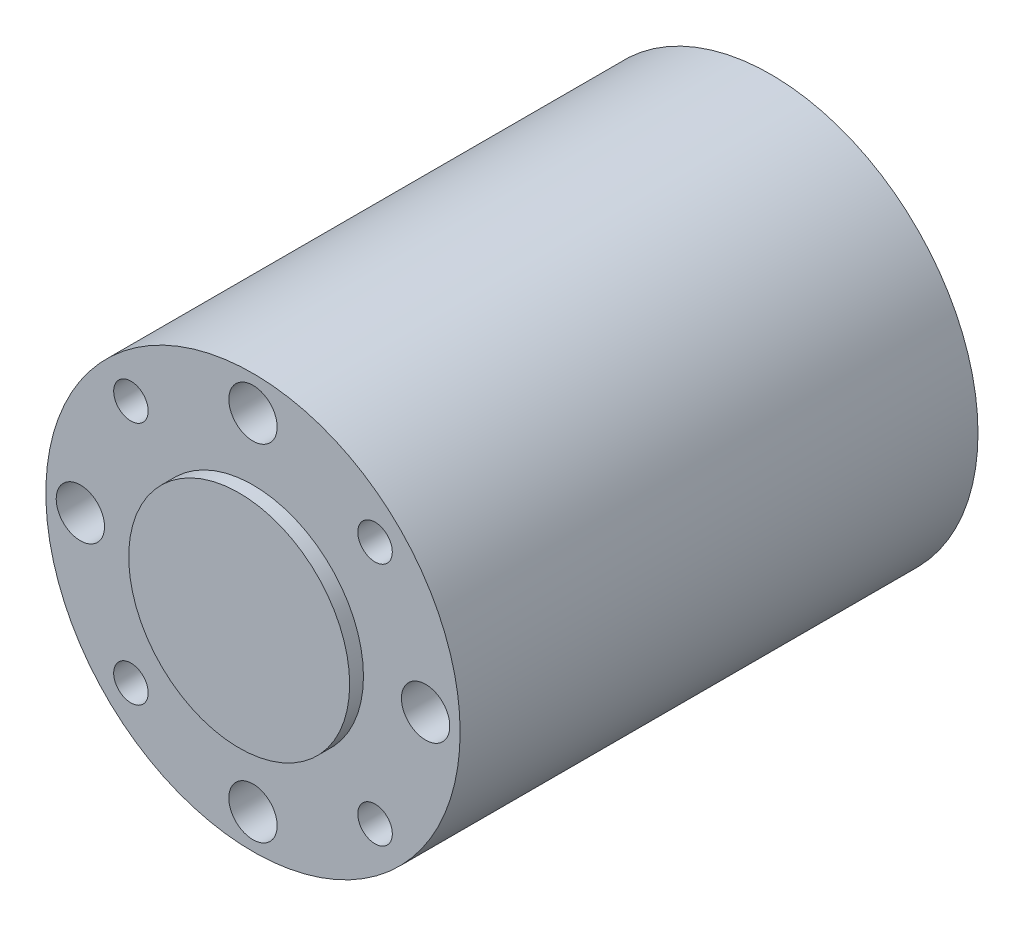
ISO-10303-21;
HEADER;
FILE_DESCRIPTION(('STEP AP214'),'2;1');
FILE_NAME('part.step','',(''),(''),'','','');
FILE_SCHEMA(('AUTOMOTIVE_DESIGN { 1 0 10303 214 1 1 1 1 }'));
ENDSEC;
DATA;
#1=APPLICATION_CONTEXT('core data for automotive mechanical design processes');
#2=APPLICATION_PROTOCOL_DEFINITION('international standard','automotive_design',2000,#1);
#3=PRODUCT_CONTEXT('',#1,'mechanical');
#4=PRODUCT('Part','Part','',(#3));
#5=PRODUCT_RELATED_PRODUCT_CATEGORY('part','',(#4));
#6=PRODUCT_DEFINITION_FORMATION('','',#4);
#7=PRODUCT_DEFINITION_CONTEXT('part definition',#1,'design');
#8=PRODUCT_DEFINITION('design','',#6,#7);
#9=PRODUCT_DEFINITION_SHAPE('','',#8);
#10=(LENGTH_UNIT() NAMED_UNIT(*) SI_UNIT(.MILLI.,.METRE.));
#11=(NAMED_UNIT(*) PLANE_ANGLE_UNIT() SI_UNIT($,.RADIAN.));
#12=(NAMED_UNIT(*) SI_UNIT($,.STERADIAN.) SOLID_ANGLE_UNIT());
#13=UNCERTAINTY_MEASURE_WITH_UNIT(LENGTH_MEASURE(1.E-05),#10,'distance_accuracy_value','');
#14=(GEOMETRIC_REPRESENTATION_CONTEXT(3) GLOBAL_UNCERTAINTY_ASSIGNED_CONTEXT((#13)) GLOBAL_UNIT_ASSIGNED_CONTEXT((#10,
#11,#12)) REPRESENTATION_CONTEXT('',''));
#15=CARTESIAN_POINT('',(0.,0.,0.));
#16=DIRECTION('',(0.,0.,1.));
#17=DIRECTION('',(1.,0.,0.));
#18=AXIS2_PLACEMENT_3D('',#15,#16,#17);
#19=CARTESIAN_POINT('',(0.,0.,75.));
#20=DIRECTION('',(0.,0.,-1.));
#21=DIRECTION('',(-1.,0.,0.));
#22=AXIS2_PLACEMENT_3D('',#19,#20,#21);
#23=CYLINDRICAL_SURFACE('',#22,30.);
#24=CARTESIAN_POINT('',(0.,0.,75.));
#25=DIRECTION('',(0.,0.,1.));
#26=DIRECTION('',(1.,0.,0.));
#27=AXIS2_PLACEMENT_3D('',#24,#25,#26);
#28=CIRCLE('',#27,30.);
#29=CARTESIAN_POINT('',(30.,0.,75.));
#30=VERTEX_POINT('',#29);
#31=EDGE_CURVE('E10',#30,#30,#28,.T.);
#32=ORIENTED_EDGE('',*,*,#31,.F.);
#33=EDGE_LOOP('',(#32));
#34=FACE_BOUND('',#33,.T.);
#35=CARTESIAN_POINT('',(0.,0.,0.));
#36=DIRECTION('',(0.,0.,1.));
#37=DIRECTION('',(1.,0.,0.));
#38=AXIS2_PLACEMENT_3D('',#35,#36,#37);
#39=CIRCLE('',#38,30.);
#40=CARTESIAN_POINT('',(30.,0.,0.));
#41=VERTEX_POINT('',#40);
#42=EDGE_CURVE('E42',#41,#41,#39,.T.);
#43=ORIENTED_EDGE('',*,*,#42,.T.);
#44=EDGE_LOOP('',(#43));
#45=FACE_BOUND('',#44,.T.);
#46=ADVANCED_FACE('F39',(#34,#45),#23,.T.);
#47=CARTESIAN_POINT('',(0.,0.,75.));
#48=DIRECTION('',(0.,0.,1.));
#49=DIRECTION('',(1.,0.,0.));
#50=AXIS2_PLACEMENT_3D('',#47,#48,#49);
#51=PLANE('',#50);
#52=CARTESIAN_POINT('',(0.,0.,75.));
#53=DIRECTION('',(0.,0.,1.));
#54=DIRECTION('',(1.,0.,0.));
#55=AXIS2_PLACEMENT_3D('',#52,#53,#54);
#56=CIRCLE('',#55,16.);
#57=CARTESIAN_POINT('',(16.,0.,75.));
#58=VERTEX_POINT('',#57);
#59=EDGE_CURVE('E99',#58,#58,#56,.T.);
#60=ORIENTED_EDGE('',*,*,#59,.F.);
#61=EDGE_LOOP('',(#60));
#62=FACE_BOUND('',#61,.T.);
#63=CARTESIAN_POINT('',(0.,25.,75.));
#64=DIRECTION('',(0.,0.,1.));
#65=DIRECTION('',(1.,0.,0.));
#66=AXIS2_PLACEMENT_3D('',#63,#64,#65);
#67=CIRCLE('',#66,3.5);
#68=CARTESIAN_POINT('',(3.5,25.,75.));
#69=VERTEX_POINT('',#68);
#70=EDGE_CURVE('E76',#69,#69,#67,.T.);
#71=ORIENTED_EDGE('',*,*,#70,.F.);
#72=EDGE_LOOP('',(#71));
#73=FACE_BOUND('',#72,.T.);
#74=CARTESIAN_POINT('',(-5.44703171456717E-13,-25.,75.));
#75=DIRECTION('',(0.,0.,1.));
#76=DIRECTION('',(1.,0.,0.));
#77=AXIS2_PLACEMENT_3D('',#74,#75,#76);
#78=CIRCLE('',#77,3.5);
#79=CARTESIAN_POINT('',(3.49999999999946,-25.,75.));
#80=VERTEX_POINT('',#79);
#81=EDGE_CURVE('E80',#80,#80,#78,.T.);
#82=ORIENTED_EDGE('',*,*,#81,.F.);
#83=EDGE_LOOP('',(#82));
#84=FACE_BOUND('',#83,.T.);
#85=CARTESIAN_POINT('',(-25.,2.67147415300428E-13,75.));
#86=DIRECTION('',(0.,0.,1.));
#87=DIRECTION('',(-1.,0.,0.));
#88=AXIS2_PLACEMENT_3D('',#85,#86,#87);
#89=CIRCLE('',#88,3.5);
#90=CARTESIAN_POINT('',(-28.5,2.67147415300428E-13,75.));
#91=VERTEX_POINT('',#90);
#92=EDGE_CURVE('E87',#91,#91,#89,.T.);
#93=ORIENTED_EDGE('',*,*,#92,.F.);
#94=EDGE_LOOP('',(#93));
#95=FACE_BOUND('',#94,.T.);
#96=CARTESIAN_POINT('',(25.,2.81025203108243E-13,75.));
#97=DIRECTION('',(0.,0.,1.));
#98=DIRECTION('',(-1.,0.,0.));
#99=AXIS2_PLACEMENT_3D('',#96,#97,#98);
#100=CIRCLE('',#99,3.50000000000001);
#101=CARTESIAN_POINT('',(21.5,2.81025203108243E-13,75.));
#102=VERTEX_POINT('',#101);
#103=EDGE_CURVE('E55',#102,#102,#100,.T.);
#104=ORIENTED_EDGE('',*,*,#103,.F.);
#105=EDGE_LOOP('',(#104));
#106=FACE_BOUND('',#105,.T.);
#107=CARTESIAN_POINT('',(-17.6776695296636,-17.6776695296638,75.));
#108=DIRECTION('',(0.,0.,1.));
#109=DIRECTION('',(1.,0.,0.));
#110=AXIS2_PLACEMENT_3D('',#107,#108,#109);
#111=CIRCLE('',#110,2.5);
#112=CARTESIAN_POINT('',(-15.1776695296636,-17.6776695296638,75.));
#113=VERTEX_POINT('',#112);
#114=EDGE_CURVE('E54',#113,#113,#111,.T.);
#115=ORIENTED_EDGE('',*,*,#114,.F.);
#116=EDGE_LOOP('',(#115));
#117=FACE_BOUND('',#116,.T.);
#118=CARTESIAN_POINT('',(17.6776695296636,-17.6776695296638,75.));
#119=DIRECTION('',(0.,0.,1.));
#120=DIRECTION('',(-1.,0.,0.));
#121=AXIS2_PLACEMENT_3D('',#118,#119,#120);
#122=CIRCLE('',#121,2.5);
#123=CARTESIAN_POINT('',(15.1776695296636,-17.6776695296638,75.));
#124=VERTEX_POINT('',#123);
#125=EDGE_CURVE('E61',#124,#124,#122,.T.);
#126=ORIENTED_EDGE('',*,*,#125,.F.);
#127=EDGE_LOOP('',(#126));
#128=FACE_BOUND('',#127,.T.);
#129=CARTESIAN_POINT('',(17.6776695296636,17.6776695296638,75.));
#130=DIRECTION('',(0.,0.,1.));
#131=DIRECTION('',(1.,0.,0.));
#132=AXIS2_PLACEMENT_3D('',#129,#130,#131);
#133=CIRCLE('',#132,2.5);
#134=CARTESIAN_POINT('',(20.1776695296636,17.6776695296638,75.));
#135=VERTEX_POINT('',#134);
#136=EDGE_CURVE('E67',#135,#135,#133,.T.);
#137=ORIENTED_EDGE('',*,*,#136,.F.);
#138=EDGE_LOOP('',(#137));
#139=FACE_BOUND('',#138,.T.);
#140=CARTESIAN_POINT('',(-17.6776695296636,17.6776695296638,75.));
#141=DIRECTION('',(0.,0.,1.));
#142=DIRECTION('',(-1.,0.,0.));
#143=AXIS2_PLACEMENT_3D('',#140,#141,#142);
#144=CIRCLE('',#143,2.5);
#145=CARTESIAN_POINT('',(-20.1776695296636,17.6776695296638,75.));
#146=VERTEX_POINT('',#145);
#147=EDGE_CURVE('E73',#146,#146,#144,.T.);
#148=ORIENTED_EDGE('',*,*,#147,.F.);
#149=EDGE_LOOP('',(#148));
#150=FACE_BOUND('',#149,.T.);
#151=ORIENTED_EDGE('',*,*,#31,.T.);
#152=EDGE_LOOP('',(#151));
#153=FACE_BOUND('',#152,.T.);
#154=ADVANCED_FACE('F114',(#62,#73,#84,#95,#106,#117,#128,#139,#150,#153),#51,.T.);
#155=CARTESIAN_POINT('',(0.,0.,0.));
#156=DIRECTION('',(0.,0.,1.));
#157=DIRECTION('',(1.,0.,0.));
#158=AXIS2_PLACEMENT_3D('',#155,#156,#157);
#159=PLANE('',#158);
#160=ORIENTED_EDGE('',*,*,#42,.F.);
#161=EDGE_LOOP('',(#160));
#162=FACE_BOUND('',#161,.T.);
#163=ADVANCED_FACE('F117',(#162),#159,.F.);
#164=CARTESIAN_POINT('',(-17.6776695296636,17.6776695296638,65.));
#165=DIRECTION('',(0.,0.,1.));
#166=DIRECTION('',(1.,0.,0.));
#167=AXIS2_PLACEMENT_3D('',#164,#165,#166);
#168=CYLINDRICAL_SURFACE('',#167,2.5);
#169=CARTESIAN_POINT('',(-17.6776695296636,17.6776695296638,65.));
#170=DIRECTION('',(0.,0.,1.));
#171=DIRECTION('',(-1.,0.,0.));
#172=AXIS2_PLACEMENT_3D('',#169,#170,#171);
#173=CIRCLE('',#172,2.5);
#174=CARTESIAN_POINT('',(-20.1776695296636,17.6776695296638,65.));
#175=VERTEX_POINT('',#174);
#176=EDGE_CURVE('E70',#175,#175,#173,.T.);
#177=ORIENTED_EDGE('',*,*,#176,.F.);
#178=EDGE_LOOP('',(#177));
#179=FACE_BOUND('',#178,.T.);
#180=ORIENTED_EDGE('',*,*,#147,.T.);
#181=EDGE_LOOP('',(#180));
#182=FACE_BOUND('',#181,.T.);
#183=ADVANCED_FACE('F135',(#179,#182),#168,.F.);
#184=CARTESIAN_POINT('',(-17.6776695296636,17.6776695296638,65.));
#185=DIRECTION('',(0.,0.,-1.));
#186=DIRECTION('',(-1.,0.,0.));
#187=AXIS2_PLACEMENT_3D('',#184,#185,#186);
#188=PLANE('',#187);
#189=ORIENTED_EDGE('',*,*,#176,.T.);
#190=EDGE_LOOP('',(#189));
#191=FACE_BOUND('',#190,.T.);
#192=ADVANCED_FACE('F137',(#191),#188,.F.);
#193=CARTESIAN_POINT('',(17.6776695296636,17.6776695296638,65.));
#194=DIRECTION('',(0.,0.,1.));
#195=DIRECTION('',(1.,0.,0.));
#196=AXIS2_PLACEMENT_3D('',#193,#194,#195);
#197=CYLINDRICAL_SURFACE('',#196,2.5);
#198=CARTESIAN_POINT('',(17.6776695296636,17.6776695296638,65.));
#199=DIRECTION('',(0.,0.,1.));
#200=DIRECTION('',(1.,0.,0.));
#201=AXIS2_PLACEMENT_3D('',#198,#199,#200);
#202=CIRCLE('',#201,2.5);
#203=CARTESIAN_POINT('',(20.1776695296636,17.6776695296638,65.));
#204=VERTEX_POINT('',#203);
#205=EDGE_CURVE('E64',#204,#204,#202,.T.);
#206=ORIENTED_EDGE('',*,*,#205,.F.);
#207=EDGE_LOOP('',(#206));
#208=FACE_BOUND('',#207,.T.);
#209=ORIENTED_EDGE('',*,*,#136,.T.);
#210=EDGE_LOOP('',(#209));
#211=FACE_BOUND('',#210,.T.);
#212=ADVANCED_FACE('F144',(#208,#211),#197,.F.);
#213=CARTESIAN_POINT('',(17.6776695296636,17.6776695296638,65.));
#214=DIRECTION('',(0.,0.,1.));
#215=DIRECTION('',(1.,0.,0.));
#216=AXIS2_PLACEMENT_3D('',#213,#214,#215);
#217=PLANE('',#216);
#218=ORIENTED_EDGE('',*,*,#205,.T.);
#219=EDGE_LOOP('',(#218));
#220=FACE_BOUND('',#219,.T.);
#221=ADVANCED_FACE('F185',(#220),#217,.T.);
#222=CARTESIAN_POINT('',(17.6776695296636,-17.6776695296638,65.));
#223=DIRECTION('',(0.,0.,1.));
#224=DIRECTION('',(1.,0.,0.));
#225=AXIS2_PLACEMENT_3D('',#222,#223,#224);
#226=CYLINDRICAL_SURFACE('',#225,2.5);
#227=CARTESIAN_POINT('',(17.6776695296636,-17.6776695296638,65.));
#228=DIRECTION('',(0.,0.,1.));
#229=DIRECTION('',(-1.,0.,0.));
#230=AXIS2_PLACEMENT_3D('',#227,#228,#229);
#231=CIRCLE('',#230,2.5);
#232=CARTESIAN_POINT('',(15.1776695296636,-17.6776695296638,65.));
#233=VERTEX_POINT('',#232);
#234=EDGE_CURVE('E58',#233,#233,#231,.T.);
#235=ORIENTED_EDGE('',*,*,#234,.F.);
#236=EDGE_LOOP('',(#235));
#237=FACE_BOUND('',#236,.T.);
#238=ORIENTED_EDGE('',*,*,#125,.T.);
#239=EDGE_LOOP('',(#238));
#240=FACE_BOUND('',#239,.T.);
#241=ADVANCED_FACE('F195',(#237,#240),#226,.F.);
#242=CARTESIAN_POINT('',(17.6776695296636,-17.6776695296638,65.));
#243=DIRECTION('',(0.,0.,-1.));
#244=DIRECTION('',(-1.,0.,0.));
#245=AXIS2_PLACEMENT_3D('',#242,#243,#244);
#246=PLANE('',#245);
#247=ORIENTED_EDGE('',*,*,#234,.T.);
#248=EDGE_LOOP('',(#247));
#249=FACE_BOUND('',#248,.T.);
#250=ADVANCED_FACE('F205',(#249),#246,.F.);
#251=CARTESIAN_POINT('',(-17.6776695296636,-17.6776695296638,65.));
#252=DIRECTION('',(0.,0.,1.));
#253=DIRECTION('',(1.,0.,0.));
#254=AXIS2_PLACEMENT_3D('',#251,#252,#253);
#255=CYLINDRICAL_SURFACE('',#254,2.5);
#256=CARTESIAN_POINT('',(-17.6776695296636,-17.6776695296638,65.));
#257=DIRECTION('',(0.,0.,1.));
#258=DIRECTION('',(1.,0.,0.));
#259=AXIS2_PLACEMENT_3D('',#256,#257,#258);
#260=CIRCLE('',#259,2.5);
#261=CARTESIAN_POINT('',(-15.1776695296636,-17.6776695296638,65.));
#262=VERTEX_POINT('',#261);
#263=EDGE_CURVE('E51',#262,#262,#260,.T.);
#264=ORIENTED_EDGE('',*,*,#263,.F.);
#265=EDGE_LOOP('',(#264));
#266=FACE_BOUND('',#265,.T.);
#267=ORIENTED_EDGE('',*,*,#114,.T.);
#268=EDGE_LOOP('',(#267));
#269=FACE_BOUND('',#268,.T.);
#270=ADVANCED_FACE('F215',(#266,#269),#255,.F.);
#271=CARTESIAN_POINT('',(-17.6776695296636,-17.6776695296638,65.));
#272=DIRECTION('',(0.,0.,1.));
#273=DIRECTION('',(1.,0.,0.));
#274=AXIS2_PLACEMENT_3D('',#271,#272,#273);
#275=PLANE('',#274);
#276=ORIENTED_EDGE('',*,*,#263,.T.);
#277=EDGE_LOOP('',(#276));
#278=FACE_BOUND('',#277,.T.);
#279=ADVANCED_FACE('F225',(#278),#275,.T.);
#280=CARTESIAN_POINT('',(25.,2.81025203108243E-13,65.));
#281=DIRECTION('',(0.,0.,1.));
#282=DIRECTION('',(1.,0.,0.));
#283=AXIS2_PLACEMENT_3D('',#280,#281,#282);
#284=CYLINDRICAL_SURFACE('',#283,3.50000000000001);
#285=CARTESIAN_POINT('',(25.,2.81025203108243E-13,65.));
#286=DIRECTION('',(0.,0.,1.));
#287=DIRECTION('',(-1.,0.,0.));
#288=AXIS2_PLACEMENT_3D('',#285,#286,#287);
#289=CIRCLE('',#288,3.50000000000001);
#290=CARTESIAN_POINT('',(21.5,2.81025203108243E-13,65.));
#291=VERTEX_POINT('',#290);
#292=EDGE_CURVE('E90',#291,#291,#289,.T.);
#293=ORIENTED_EDGE('',*,*,#292,.F.);
#294=EDGE_LOOP('',(#293));
#295=FACE_BOUND('',#294,.T.);
#296=ORIENTED_EDGE('',*,*,#103,.T.);
#297=EDGE_LOOP('',(#296));
#298=FACE_BOUND('',#297,.T.);
#299=ADVANCED_FACE('F235',(#295,#298),#284,.F.);
#300=CARTESIAN_POINT('',(25.,2.81025203108243E-13,65.));
#301=DIRECTION('',(0.,0.,-1.));
#302=DIRECTION('',(-1.,0.,0.));
#303=AXIS2_PLACEMENT_3D('',#300,#301,#302);
#304=PLANE('',#303);
#305=ORIENTED_EDGE('',*,*,#292,.T.);
#306=EDGE_LOOP('',(#305));
#307=FACE_BOUND('',#306,.T.);
#308=ADVANCED_FACE('F245',(#307),#304,.F.);
#309=CARTESIAN_POINT('',(-25.,2.67147415300428E-13,65.));
#310=DIRECTION('',(0.,0.,1.));
#311=DIRECTION('',(1.,0.,0.));
#312=AXIS2_PLACEMENT_3D('',#309,#310,#311);
#313=CYLINDRICAL_SURFACE('',#312,3.5);
#314=CARTESIAN_POINT('',(-25.,2.67147415300428E-13,65.));
#315=DIRECTION('',(0.,0.,1.));
#316=DIRECTION('',(-1.,0.,0.));
#317=AXIS2_PLACEMENT_3D('',#314,#315,#316);
#318=CIRCLE('',#317,3.5);
#319=CARTESIAN_POINT('',(-28.5,2.67147415300428E-13,65.));
#320=VERTEX_POINT('',#319);
#321=EDGE_CURVE('E84',#320,#320,#318,.T.);
#322=ORIENTED_EDGE('',*,*,#321,.F.);
#323=EDGE_LOOP('',(#322));
#324=FACE_BOUND('',#323,.T.);
#325=ORIENTED_EDGE('',*,*,#92,.T.);
#326=EDGE_LOOP('',(#325));
#327=FACE_BOUND('',#326,.T.);
#328=ADVANCED_FACE('F255',(#324,#327),#313,.F.);
#329=CARTESIAN_POINT('',(-25.,2.67147415300428E-13,65.));
#330=DIRECTION('',(0.,0.,-1.));
#331=DIRECTION('',(-1.,0.,0.));
#332=AXIS2_PLACEMENT_3D('',#329,#330,#331);
#333=PLANE('',#332);
#334=ORIENTED_EDGE('',*,*,#321,.T.);
#335=EDGE_LOOP('',(#334));
#336=FACE_BOUND('',#335,.T.);
#337=ADVANCED_FACE('F265',(#336),#333,.F.);
#338=CARTESIAN_POINT('',(-5.44703171456717E-13,-25.,65.));
#339=DIRECTION('',(0.,0.,1.));
#340=DIRECTION('',(1.,0.,0.));
#341=AXIS2_PLACEMENT_3D('',#338,#339,#340);
#342=CYLINDRICAL_SURFACE('',#341,3.5);
#343=CARTESIAN_POINT('',(-5.44703171456717E-13,-25.,65.));
#344=DIRECTION('',(0.,0.,1.));
#345=DIRECTION('',(1.,0.,0.));
#346=AXIS2_PLACEMENT_3D('',#343,#344,#345);
#347=CIRCLE('',#346,3.5);
#348=CARTESIAN_POINT('',(3.49999999999946,-25.,65.));
#349=VERTEX_POINT('',#348);
#350=EDGE_CURVE('E77',#349,#349,#347,.T.);
#351=ORIENTED_EDGE('',*,*,#350,.F.);
#352=EDGE_LOOP('',(#351));
#353=FACE_BOUND('',#352,.T.);
#354=ORIENTED_EDGE('',*,*,#81,.T.);
#355=EDGE_LOOP('',(#354));
#356=FACE_BOUND('',#355,.T.);
#357=ADVANCED_FACE('F275',(#353,#356),#342,.F.);
#358=CARTESIAN_POINT('',(-5.44703171456717E-13,-25.,65.));
#359=DIRECTION('',(0.,0.,1.));
#360=DIRECTION('',(1.,0.,0.));
#361=AXIS2_PLACEMENT_3D('',#358,#359,#360);
#362=PLANE('',#361);
#363=ORIENTED_EDGE('',*,*,#350,.T.);
#364=EDGE_LOOP('',(#363));
#365=FACE_BOUND('',#364,.T.);
#366=ADVANCED_FACE('F285',(#365),#362,.T.);
#367=CARTESIAN_POINT('',(0.,25.,65.));
#368=DIRECTION('',(0.,0.,1.));
#369=DIRECTION('',(1.,0.,0.));
#370=AXIS2_PLACEMENT_3D('',#367,#368,#369);
#371=CYLINDRICAL_SURFACE('',#370,3.5);
#372=CARTESIAN_POINT('',(0.,25.,65.));
#373=DIRECTION('',(0.,0.,1.));
#374=DIRECTION('',(1.,0.,0.));
#375=AXIS2_PLACEMENT_3D('',#372,#373,#374);
#376=CIRCLE('',#375,3.5);
#377=CARTESIAN_POINT('',(3.5,25.,65.));
#378=VERTEX_POINT('',#377);
#379=EDGE_CURVE('E49',#378,#378,#376,.T.);
#380=ORIENTED_EDGE('',*,*,#379,.F.);
#381=EDGE_LOOP('',(#380));
#382=FACE_BOUND('',#381,.T.);
#383=ORIENTED_EDGE('',*,*,#70,.T.);
#384=EDGE_LOOP('',(#383));
#385=FACE_BOUND('',#384,.T.);
#386=ADVANCED_FACE('F295',(#382,#385),#371,.F.);
#387=CARTESIAN_POINT('',(0.,25.,65.));
#388=DIRECTION('',(0.,0.,1.));
#389=DIRECTION('',(1.,0.,0.));
#390=AXIS2_PLACEMENT_3D('',#387,#388,#389);
#391=PLANE('',#390);
#392=ORIENTED_EDGE('',*,*,#379,.T.);
#393=EDGE_LOOP('',(#392));
#394=FACE_BOUND('',#393,.T.);
#395=ADVANCED_FACE('F110',(#394),#391,.T.);
#396=CARTESIAN_POINT('',(0.,0.,77.));
#397=DIRECTION('',(0.,0.,-1.));
#398=DIRECTION('',(-1.,0.,0.));
#399=AXIS2_PLACEMENT_3D('',#396,#397,#398);
#400=CYLINDRICAL_SURFACE('',#399,16.);
#401=CARTESIAN_POINT('',(0.,0.,77.));
#402=DIRECTION('',(0.,0.,1.));
#403=DIRECTION('',(1.,0.,0.));
#404=AXIS2_PLACEMENT_3D('',#401,#402,#403);
#405=CIRCLE('',#404,16.);
#406=CARTESIAN_POINT('',(16.,0.,77.));
#407=VERTEX_POINT('',#406);
#408=EDGE_CURVE('E81',#407,#407,#405,.T.);
#409=ORIENTED_EDGE('',*,*,#408,.F.);
#410=EDGE_LOOP('',(#409));
#411=FACE_BOUND('',#410,.T.);
#412=ORIENTED_EDGE('',*,*,#59,.T.);
#413=EDGE_LOOP('',(#412));
#414=FACE_BOUND('',#413,.T.);
#415=ADVANCED_FACE('F107',(#411,#414),#400,.T.);
#416=CARTESIAN_POINT('',(0.,0.,77.));
#417=DIRECTION('',(0.,0.,1.));
#418=DIRECTION('',(1.,0.,0.));
#419=AXIS2_PLACEMENT_3D('',#416,#417,#418);
#420=PLANE('',#419);
#421=ORIENTED_EDGE('',*,*,#408,.T.);
#422=EDGE_LOOP('',(#421));
#423=FACE_BOUND('',#422,.T.);
#424=ADVANCED_FACE('F105',(#423),#420,.T.);
#425=CLOSED_SHELL('',(#46,#154,#163,#183,#192,#212,#221,#241,#250,#270,#279,#299,#308,#328,#337,
#357,#366,#386,#395,#415,#424));
#426=MANIFOLD_SOLID_BREP('B2',#425);
#427=ADVANCED_BREP_SHAPE_REPRESENTATION('',(#18,#426),#14);
#428=SHAPE_DEFINITION_REPRESENTATION(#9,#427);
ENDSEC;
END-ISO-10303-21;
